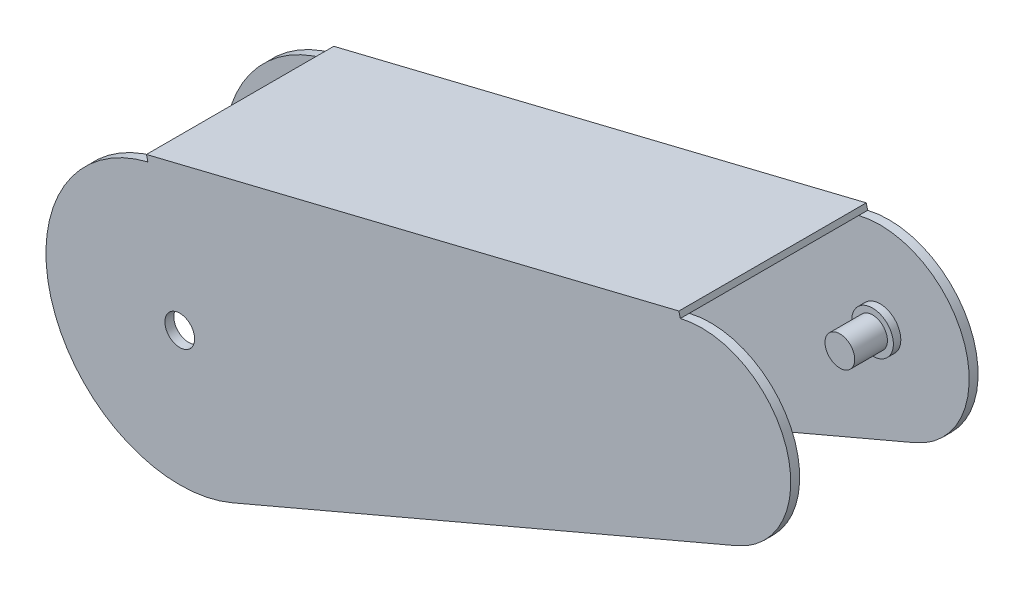
ISO-10303-21;
HEADER;
FILE_DESCRIPTION(('STEP AP214'),'2;1');
FILE_NAME('part.step','',(''),(''),'','','');
FILE_SCHEMA(('AUTOMOTIVE_DESIGN { 1 0 10303 214 1 1 1 1 }'));
ENDSEC;
DATA;
#1=APPLICATION_CONTEXT('core data for automotive mechanical design processes');
#2=APPLICATION_PROTOCOL_DEFINITION('international standard','automotive_design',2000,#1);
#3=PRODUCT_CONTEXT('',#1,'mechanical');
#4=PRODUCT('Part','Part','',(#3));
#5=PRODUCT_RELATED_PRODUCT_CATEGORY('part','',(#4));
#6=PRODUCT_DEFINITION_FORMATION('','',#4);
#7=PRODUCT_DEFINITION_CONTEXT('part definition',#1,'design');
#8=PRODUCT_DEFINITION('design','',#6,#7);
#9=PRODUCT_DEFINITION_SHAPE('','',#8);
#10=(LENGTH_UNIT() NAMED_UNIT(*) SI_UNIT(.MILLI.,.METRE.));
#11=(NAMED_UNIT(*) PLANE_ANGLE_UNIT() SI_UNIT($,.RADIAN.));
#12=(NAMED_UNIT(*) SI_UNIT($,.STERADIAN.) SOLID_ANGLE_UNIT());
#13=UNCERTAINTY_MEASURE_WITH_UNIT(LENGTH_MEASURE(1.E-05),#10,'distance_accuracy_value','');
#14=(GEOMETRIC_REPRESENTATION_CONTEXT(3) GLOBAL_UNCERTAINTY_ASSIGNED_CONTEXT((#13)) GLOBAL_UNIT_ASSIGNED_CONTEXT((#10,
#11,#12)) REPRESENTATION_CONTEXT('',''));
#15=CARTESIAN_POINT('',(0.,0.,0.));
#16=DIRECTION('',(0.,0.,1.));
#17=DIRECTION('',(1.,0.,0.));
#18=AXIS2_PLACEMENT_3D('',#15,#16,#17);
#19=CARTESIAN_POINT('',(0.,0.,60.));
#20=DIRECTION('',(0.,0.,1.));
#21=DIRECTION('',(1.,0.,0.));
#22=AXIS2_PLACEMENT_3D('',#19,#20,#21);
#23=PLANE('',#22);
#24=CARTESIAN_POINT('',(-80.2518171707876,-21.7552317239954,60.));
#25=DIRECTION('',(0.,0.,1.));
#26=DIRECTION('',(1.,0.,0.));
#27=AXIS2_PLACEMENT_3D('',#24,#25,#26);
#28=CIRCLE('',#27,45.);
#29=CARTESIAN_POINT('',(-90.9758751371117,21.9482530424957,60.));
#30=VERTEX_POINT('',#29);
#31=CARTESIAN_POINT('',(-62.6050446285357,-63.1507800213912,60.));
#32=VERTEX_POINT('',#31);
#33=EDGE_CURVE('E214',#30,#32,#28,.T.);
#34=ORIENTED_EDGE('',*,*,#33,.F.);
#35=DIRECTION('',(0.971188550366469,0.238312399251647,0.));
#36=VECTOR('',#35,1.);
#37=CARTESIAN_POINT('',(-10.2466160263854,41.7577775897378,60.));
#38=LINE('',#37,#36);
#39=CARTESIAN_POINT('',(88.1024451932382,65.8908882349895,60.));
#40=VERTEX_POINT('',#39);
#41=EDGE_CURVE('E227',#30,#40,#38,.T.);
#42=ORIENTED_EDGE('',*,*,#41,.T.);
#43=CARTESIAN_POINT('',(95.2518171707876,36.7552317239955,60.));
#44=DIRECTION('',(0.,0.,1.));
#45=DIRECTION('',(1.,0.,0.));
#46=AXIS2_PLACEMENT_3D('',#43,#44,#45);
#47=CIRCLE('',#46,30.);
#48=CARTESIAN_POINT('',(107.016332198955,9.15819952573162,60.));
#49=VERTEX_POINT('',#48);
#50=EDGE_CURVE('E223',#49,#40,#47,.T.);
#51=ORIENTED_EDGE('',*,*,#50,.F.);
#52=DIRECTION('',(0.919901073275462,0.39215050093893,0.));
#53=VECTOR('',#52,1.);
#54=CARTESIAN_POINT('',(13.1534614003655,-30.8552028634739,60.));
#55=LINE('',#54,#53);
#56=EDGE_CURVE('E219',#32,#49,#55,.T.);
#57=ORIENTED_EDGE('',*,*,#56,.F.);
#58=EDGE_LOOP('',(#34,#42,#51,#57));
#59=FACE_BOUND('',#58,.T.);
#60=DIRECTION('',(0.948668293738244,0.316272775394546,0.));
#61=VECTOR('',#60,1.);
#62=CARTESIAN_POINT('',(-1.83345719319717,5.49950183016123,60.));
#63=LINE('',#62,#61);
#64=CARTESIAN_POINT('',(-75.9484707196831,-19.2094097895768,60.));
#65=VERTEX_POINT('',#64);
#66=CARTESIAN_POINT('',(88.353478337391,35.5665680458877,60.));
#67=VERTEX_POINT('',#66);
#68=EDGE_CURVE('E57',#65,#67,#63,.T.);
#69=ORIENTED_EDGE('',*,*,#68,.F.);
#70=CARTESIAN_POINT('',(-80.2518171707876,-21.7552317239954,60.));
#71=DIRECTION('',(0.,0.,1.));
#72=DIRECTION('',(1.,0.,0.));
#73=AXIS2_PLACEMENT_3D('',#70,#71,#72);
#74=CIRCLE('',#73,5.);
#75=CARTESIAN_POINT('',(-75.5084757020963,-20.1738678470227,60.));
#76=VERTEX_POINT('',#75);
#77=EDGE_CURVE('E61',#65,#76,#74,.T.);
#78=ORIENTED_EDGE('',*,*,#77,.T.);
#79=DIRECTION('',(-0.948668293738244,-0.316272775394545,0.));
#80=VECTOR('',#79,1.);
#81=CARTESIAN_POINT('',(-1.50007114300225,4.49950183016122,60.));
#82=LINE('',#81,#80);
#83=CARTESIAN_POINT('',(88.6111391146199,34.5413222962336,60.));
#84=VERTEX_POINT('',#83);
#85=EDGE_CURVE('E170',#84,#76,#82,.T.);
#86=ORIENTED_EDGE('',*,*,#85,.F.);
#87=CARTESIAN_POINT('',(95.2518171707876,36.7552317239955,60.));
#88=DIRECTION('',(0.,0.,1.));
#89=DIRECTION('',(1.,0.,0.));
#90=AXIS2_PLACEMENT_3D('',#87,#88,#89);
#91=CIRCLE('',#90,7.);
#92=EDGE_CURVE('E194',#67,#84,#91,.F.);
#93=ORIENTED_EDGE('',*,*,#92,.F.);
#94=EDGE_LOOP('',(#69,#78,#86,#93));
#95=FACE_BOUND('',#94,.T.);
#96=ADVANCED_FACE('F41',(#59,#95),#23,.F.);
#97=CARTESIAN_POINT('',(95.2518171707876,36.7552317239955,57.5));
#98=DIRECTION('',(0.,0.,1.));
#99=DIRECTION('',(1.,0.,0.));
#100=AXIS2_PLACEMENT_3D('',#97,#98,#99);
#101=CYLINDRICAL_SURFACE('',#100,7.);
#102=DIRECTION('',(0.,0.,1.));
#103=VECTOR('',#102,1.);
#104=CARTESIAN_POINT('',(88.353478337391,35.5665680458877,57.5));
#105=LINE('',#104,#103);
#106=CARTESIAN_POINT('',(88.353478337391,35.5665680458877,57.5));
#107=VERTEX_POINT('',#106);
#108=EDGE_CURVE('E11',#67,#107,#105,.F.);
#109=ORIENTED_EDGE('',*,*,#108,.F.);
#110=ORIENTED_EDGE('',*,*,#92,.T.);
#111=DIRECTION('',(0.,0.,1.));
#112=VECTOR('',#111,1.);
#113=CARTESIAN_POINT('',(88.6111391146199,34.5413222962336,57.5));
#114=LINE('',#113,#112);
#115=CARTESIAN_POINT('',(88.6111391146199,34.5413222962336,57.5));
#116=VERTEX_POINT('',#115);
#117=EDGE_CURVE('E50',#116,#84,#114,.T.);
#118=ORIENTED_EDGE('',*,*,#117,.F.);
#119=CARTESIAN_POINT('',(95.2518171707876,36.7552317239955,57.5));
#120=DIRECTION('',(0.,0.,-1.));
#121=DIRECTION('',(-1.,0.,0.));
#122=AXIS2_PLACEMENT_3D('',#119,#120,#121);
#123=CIRCLE('',#122,7.);
#124=EDGE_CURVE('E189',#107,#116,#123,.T.);
#125=ORIENTED_EDGE('',*,*,#124,.F.);
#126=EDGE_LOOP('',(#109,#110,#118,#125));
#127=FACE_BOUND('',#126,.T.);
#128=ADVANCED_FACE('F348',(#127),#101,.T.);
#129=CARTESIAN_POINT('',(0.,0.,3.));
#130=DIRECTION('',(0.,0.,1.));
#131=DIRECTION('',(1.,0.,0.));
#132=AXIS2_PLACEMENT_3D('',#129,#130,#131);
#133=PLANE('',#132);
#134=CARTESIAN_POINT('',(-80.2518171707876,-21.7552317239954,3.));
#135=DIRECTION('',(0.,0.,1.));
#136=DIRECTION('',(1.,0.,0.));
#137=AXIS2_PLACEMENT_3D('',#134,#135,#136);
#138=CIRCLE('',#137,5.);
#139=CARTESIAN_POINT('',(-75.2518171707876,-21.7552317239954,3.));
#140=VERTEX_POINT('',#139);
#141=EDGE_CURVE('E306',#140,#140,#138,.T.);
#142=ORIENTED_EDGE('',*,*,#141,.F.);
#143=EDGE_LOOP('',(#142));
#144=FACE_BOUND('',#143,.T.);
#145=DIRECTION('',(0.919901073275462,0.39215050093893,0.));
#146=VECTOR('',#145,1.);
#147=CARTESIAN_POINT('',(13.1534614003655,-30.8552028634739,3.));
#148=LINE('',#147,#146);
#149=CARTESIAN_POINT('',(-62.6050446285357,-63.1507800213912,3.));
#150=VERTEX_POINT('',#149);
#151=CARTESIAN_POINT('',(107.016332198955,9.15819952573162,3.));
#152=VERTEX_POINT('',#151);
#153=EDGE_CURVE('E290',#150,#152,#148,.T.);
#154=ORIENTED_EDGE('',*,*,#153,.T.);
#155=CARTESIAN_POINT('',(95.2518171707876,36.7552317239955,3.));
#156=DIRECTION('',(0.,0.,1.));
#157=DIRECTION('',(1.,0.,0.));
#158=AXIS2_PLACEMENT_3D('',#155,#156,#157);
#159=CIRCLE('',#158,30.);
#160=CARTESIAN_POINT('',(88.1024451932382,65.8908882349895,3.));
#161=VERTEX_POINT('',#160);
#162=EDGE_CURVE('E294',#152,#161,#159,.T.);
#163=ORIENTED_EDGE('',*,*,#162,.T.);
#164=DIRECTION('',(0.971188550366469,0.238312399251647,0.));
#165=VECTOR('',#164,1.);
#166=CARTESIAN_POINT('',(-10.2466160263854,41.7577775897378,3.));
#167=LINE('',#166,#165);
#168=CARTESIAN_POINT('',(-90.9758751371117,21.9482530424957,3.));
#169=VERTEX_POINT('',#168);
#170=EDGE_CURVE('E299',#169,#161,#167,.T.);
#171=ORIENTED_EDGE('',*,*,#170,.F.);
#172=CARTESIAN_POINT('',(-80.2518171707876,-21.7552317239954,3.));
#173=DIRECTION('',(0.,0.,1.));
#174=DIRECTION('',(1.,0.,0.));
#175=AXIS2_PLACEMENT_3D('',#172,#173,#174);
#176=CIRCLE('',#175,45.);
#177=EDGE_CURVE('E303',#169,#150,#176,.T.);
#178=ORIENTED_EDGE('',*,*,#177,.T.);
#179=EDGE_LOOP('',(#154,#163,#171,#178));
#180=FACE_BOUND('',#179,.T.);
#181=CARTESIAN_POINT('',(95.2518171707876,36.7552317239955,3.));
#182=DIRECTION('',(0.,0.,1.));
#183=DIRECTION('',(1.,0.,0.));
#184=AXIS2_PLACEMENT_3D('',#181,#182,#183);
#185=CIRCLE('',#184,7.);
#186=CARTESIAN_POINT('',(102.251817170788,36.7552317239955,3.));
#187=VERTEX_POINT('',#186);
#188=EDGE_CURVE('E203',#187,#187,#185,.T.);
#189=ORIENTED_EDGE('',*,*,#188,.F.);
#190=EDGE_LOOP('',(#189));
#191=FACE_BOUND('',#190,.T.);
#192=ADVANCED_FACE('F374',(#144,#180,#191),#133,.T.);
#193=CARTESIAN_POINT('',(-10.2466160263854,41.7577775897378,0.));
#194=DIRECTION('',(-0.238312399251647,0.971188550366469,0.));
#195=DIRECTION('',(-0.971188550366469,-0.238312399251647,0.));
#196=AXIS2_PLACEMENT_3D('',#193,#194,#195);
#197=PLANE('',#196);
#198=ORIENTED_EDGE('',*,*,#41,.F.);
#199=DIRECTION('',(0.,0.,1.));
#200=VECTOR('',#199,1.);
#201=CARTESIAN_POINT('',(-90.9758751371117,21.9482530424957,0.));
#202=LINE('',#201,#200);
#203=EDGE_CURVE('E248',#169,#30,#202,.T.);
#204=ORIENTED_EDGE('',*,*,#203,.F.);
#205=ORIENTED_EDGE('',*,*,#170,.T.);
#206=DIRECTION('',(0.,0.,-1.));
#207=VECTOR('',#206,1.);
#208=CARTESIAN_POINT('',(88.1024451932382,65.8908882349895,0.));
#209=LINE('',#208,#207);
#210=EDGE_CURVE('E272',#40,#161,#209,.T.);
#211=ORIENTED_EDGE('',*,*,#210,.F.);
#212=EDGE_LOOP('',(#198,#204,#205,#211));
#213=FACE_BOUND('',#212,.T.);
#214=ADVANCED_FACE('F401',(#213),#197,.F.);
#215=CARTESIAN_POINT('',(13.1534614003655,-30.8552028634739,3.));
#216=DIRECTION('',(-0.39215050093893,0.919901073275462,0.));
#217=DIRECTION('',(-0.919901073275462,-0.39215050093893,0.));
#218=AXIS2_PLACEMENT_3D('',#215,#216,#217);
#219=PLANE('',#218);
#220=DIRECTION('',(0.919901073275462,0.39215050093893,0.));
#221=VECTOR('',#220,1.);
#222=CARTESIAN_POINT('',(13.1534614003655,-30.8552028634739,0.));
#223=LINE('',#222,#221);
#224=CARTESIAN_POINT('',(-62.6050446285357,-63.1507800213912,0.));
#225=VERTEX_POINT('',#224);
#226=CARTESIAN_POINT('',(107.016332198955,9.15819952573162,0.));
#227=VERTEX_POINT('',#226);
#228=EDGE_CURVE('E289',#225,#227,#223,.T.);
#229=ORIENTED_EDGE('',*,*,#228,.T.);
#230=DIRECTION('',(0.,0.,-1.));
#231=VECTOR('',#230,1.);
#232=CARTESIAN_POINT('',(107.016332198955,9.15819952573162,3.));
#233=LINE('',#232,#231);
#234=EDGE_CURVE('E335',#152,#227,#233,.T.);
#235=ORIENTED_EDGE('',*,*,#234,.F.);
#236=ORIENTED_EDGE('',*,*,#153,.F.);
#237=DIRECTION('',(0.,0.,-1.));
#238=VECTOR('',#237,1.);
#239=CARTESIAN_POINT('',(-62.6050446285357,-63.1507800213912,3.));
#240=LINE('',#239,#238);
#241=EDGE_CURVE('E310',#150,#225,#240,.T.);
#242=ORIENTED_EDGE('',*,*,#241,.T.);
#243=EDGE_LOOP('',(#229,#235,#236,#242));
#244=FACE_BOUND('',#243,.T.);
#245=ADVANCED_FACE('F43',(#244),#219,.F.);
#246=CARTESIAN_POINT('',(95.2518171707876,36.7552317239955,3.));
#247=DIRECTION('',(0.,0.,-1.));
#248=DIRECTION('',(-1.,0.,0.));
#249=AXIS2_PLACEMENT_3D('',#246,#247,#248);
#250=CYLINDRICAL_SURFACE('',#249,30.);
#251=CARTESIAN_POINT('',(95.2518171707876,36.7552317239955,0.));
#252=DIRECTION('',(0.,0.,1.));
#253=DIRECTION('',(1.,0.,0.));
#254=AXIS2_PLACEMENT_3D('',#251,#252,#253);
#255=CIRCLE('',#254,30.);
#256=CARTESIAN_POINT('',(88.1024451932382,65.8908882349895,0.));
#257=VERTEX_POINT('',#256);
#258=EDGE_CURVE('E314',#227,#257,#255,.T.);
#259=ORIENTED_EDGE('',*,*,#258,.T.);
#260=DIRECTION('',(0.,0.,-1.));
#261=VECTOR('',#260,1.);
#262=CARTESIAN_POINT('',(88.1024451932382,65.8908882349895,3.));
#263=LINE('',#262,#261);
#264=EDGE_CURVE('E331',#161,#257,#263,.T.);
#265=ORIENTED_EDGE('',*,*,#264,.F.);
#266=ORIENTED_EDGE('',*,*,#162,.F.);
#267=ORIENTED_EDGE('',*,*,#234,.T.);
#268=EDGE_LOOP('',(#259,#265,#266,#267));
#269=FACE_BOUND('',#268,.T.);
#270=ADVANCED_FACE('F427',(#269),#250,.T.);
#271=CARTESIAN_POINT('',(-80.2518171707876,-21.7552317239954,3.));
#272=DIRECTION('',(0.,0.,-1.));
#273=DIRECTION('',(-1.,0.,0.));
#274=AXIS2_PLACEMENT_3D('',#271,#272,#273);
#275=CYLINDRICAL_SURFACE('',#274,5.);
#276=ORIENTED_EDGE('',*,*,#141,.T.);
#277=EDGE_LOOP('',(#276));
#278=FACE_BOUND('',#277,.T.);
#279=CARTESIAN_POINT('',(-80.2518171707876,-21.7552317239954,0.));
#280=DIRECTION('',(0.,0.,1.));
#281=DIRECTION('',(1.,0.,0.));
#282=AXIS2_PLACEMENT_3D('',#279,#280,#281);
#283=CIRCLE('',#282,5.);
#284=CARTESIAN_POINT('',(-75.2518171707876,-21.7552317239954,0.));
#285=VERTEX_POINT('',#284);
#286=EDGE_CURVE('E295',#285,#285,#283,.T.);
#287=ORIENTED_EDGE('',*,*,#286,.F.);
#288=EDGE_LOOP('',(#287));
#289=FACE_BOUND('',#288,.T.);
#290=ADVANCED_FACE('F424',(#278,#289),#275,.F.);
#291=CARTESIAN_POINT('',(-80.2518171707876,-21.7552317239954,3.));
#292=DIRECTION('',(0.,0.,-1.));
#293=DIRECTION('',(-1.,0.,0.));
#294=AXIS2_PLACEMENT_3D('',#291,#292,#293);
#295=CYLINDRICAL_SURFACE('',#294,45.);
#296=CARTESIAN_POINT('',(-80.2518171707876,-21.7552317239954,0.));
#297=DIRECTION('',(0.,0.,1.));
#298=DIRECTION('',(1.,0.,0.));
#299=AXIS2_PLACEMENT_3D('',#296,#297,#298);
#300=CIRCLE('',#299,45.);
#301=CARTESIAN_POINT('',(-90.9758751371117,21.9482530424957,0.));
#302=VERTEX_POINT('',#301);
#303=EDGE_CURVE('E318',#302,#225,#300,.T.);
#304=ORIENTED_EDGE('',*,*,#303,.T.);
#305=ORIENTED_EDGE('',*,*,#241,.F.);
#306=ORIENTED_EDGE('',*,*,#177,.F.);
#307=DIRECTION('',(0.,0.,-1.));
#308=VECTOR('',#307,1.);
#309=CARTESIAN_POINT('',(-90.9758751371117,21.9482530424957,3.));
#310=LINE('',#309,#308);
#311=EDGE_CURVE('E327',#169,#302,#310,.T.);
#312=ORIENTED_EDGE('',*,*,#311,.T.);
#313=EDGE_LOOP('',(#304,#305,#306,#312));
#314=FACE_BOUND('',#313,.T.);
#315=ADVANCED_FACE('F422',(#314),#295,.T.);
#316=CARTESIAN_POINT('',(0.,0.,0.));
#317=DIRECTION('',(0.,0.,1.));
#318=DIRECTION('',(1.,0.,0.));
#319=AXIS2_PLACEMENT_3D('',#316,#317,#318);
#320=PLANE('',#319);
#321=ORIENTED_EDGE('',*,*,#228,.F.);
#322=ORIENTED_EDGE('',*,*,#303,.F.);
#323=DIRECTION('',(0.238312399251647,-0.971188550366469,0.));
#324=VECTOR('',#323,1.);
#325=CARTESIAN_POINT('',(-91.452499935615,23.8906301432286,0.));
#326=LINE('',#325,#324);
#327=CARTESIAN_POINT('',(-91.452499935615,23.8906301432286,0.));
#328=VERTEX_POINT('',#327);
#329=EDGE_CURVE('E268',#328,#302,#326,.T.);
#330=ORIENTED_EDGE('',*,*,#329,.F.);
#331=DIRECTION('',(-0.971188550366469,-0.238312399251647,0.));
#332=VECTOR('',#331,1.);
#333=CARTESIAN_POINT('',(-91.452499935615,23.8906301432286,0.));
#334=LINE('',#333,#332);
#335=CARTESIAN_POINT('',(87.6258203947349,67.8332653357225,0.));
#336=VERTEX_POINT('',#335);
#337=EDGE_CURVE('E265',#336,#328,#334,.T.);
#338=ORIENTED_EDGE('',*,*,#337,.F.);
#339=DIRECTION('',(0.238312399251647,-0.971188550366469,0.));
#340=VECTOR('',#339,1.);
#341=CARTESIAN_POINT('',(87.6258203947349,67.8332653357225,0.));
#342=LINE('',#341,#340);
#343=EDGE_CURVE('E278',#336,#257,#342,.T.);
#344=ORIENTED_EDGE('',*,*,#343,.T.);
#345=ORIENTED_EDGE('',*,*,#258,.F.);
#346=EDGE_LOOP('',(#321,#322,#330,#338,#344,#345));
#347=FACE_BOUND('',#346,.T.);
#348=ORIENTED_EDGE('',*,*,#286,.T.);
#349=EDGE_LOOP('',(#348));
#350=FACE_BOUND('',#349,.T.);
#351=ADVANCED_FACE('F415',(#347,#350),#320,.F.);
#352=CARTESIAN_POINT('',(-91.452499935615,23.8906301432286,0.));
#353=DIRECTION('',(0.971188550366469,0.238312399251647,0.));
#354=DIRECTION('',(-0.238312399251647,0.971188550366469,0.));
#355=AXIS2_PLACEMENT_3D('',#352,#353,#354);
#356=PLANE('',#355);
#357=ORIENTED_EDGE('',*,*,#311,.F.);
#358=ORIENTED_EDGE('',*,*,#203,.T.);
#359=DIRECTION('',(0.,0.,1.));
#360=VECTOR('',#359,1.);
#361=CARTESIAN_POINT('',(-90.9758751371117,21.9482530424957,60.));
#362=LINE('',#361,#360);
#363=CARTESIAN_POINT('',(-90.9758751371117,21.9482530424957,63.));
#364=VERTEX_POINT('',#363);
#365=EDGE_CURVE('E244',#30,#364,#362,.T.);
#366=ORIENTED_EDGE('',*,*,#365,.T.);
#367=DIRECTION('',(0.238312399251647,-0.971188550366469,0.));
#368=VECTOR('',#367,1.);
#369=CARTESIAN_POINT('',(-91.452499935615,23.8906301432286,63.));
#370=LINE('',#369,#368);
#371=CARTESIAN_POINT('',(-91.452499935615,23.8906301432286,63.));
#372=VERTEX_POINT('',#371);
#373=EDGE_CURVE('E285',#372,#364,#370,.T.);
#374=ORIENTED_EDGE('',*,*,#373,.F.);
#375=DIRECTION('',(0.,0.,1.));
#376=VECTOR('',#375,1.);
#377=CARTESIAN_POINT('',(-91.452499935615,23.8906301432286,0.));
#378=LINE('',#377,#376);
#379=EDGE_CURVE('E254',#328,#372,#378,.T.);
#380=ORIENTED_EDGE('',*,*,#379,.F.);
#381=ORIENTED_EDGE('',*,*,#329,.T.);
#382=EDGE_LOOP('',(#357,#358,#366,#374,#380,#381));
#383=FACE_BOUND('',#382,.T.);
#384=ADVANCED_FACE('F411',(#383),#356,.F.);
#385=CARTESIAN_POINT('',(-91.452499935615,23.8906301432286,63.));
#386=DIRECTION('',(0.,0.,-1.));
#387=DIRECTION('',(-1.,0.,0.));
#388=AXIS2_PLACEMENT_3D('',#385,#386,#387);
#389=PLANE('',#388);
#390=ORIENTED_EDGE('',*,*,#373,.T.);
#391=CARTESIAN_POINT('',(-80.2518171707876,-21.7552317239954,63.));
#392=DIRECTION('',(0.,0.,1.));
#393=DIRECTION('',(1.,0.,0.));
#394=AXIS2_PLACEMENT_3D('',#391,#392,#393);
#395=CIRCLE('',#394,45.);
#396=CARTESIAN_POINT('',(-62.6050446285357,-63.1507800213912,63.));
#397=VERTEX_POINT('',#396);
#398=EDGE_CURVE('E234',#364,#397,#395,.T.);
#399=ORIENTED_EDGE('',*,*,#398,.T.);
#400=DIRECTION('',(0.919901073275462,0.39215050093893,0.));
#401=VECTOR('',#400,1.);
#402=CARTESIAN_POINT('',(13.1534614003655,-30.8552028634739,63.));
#403=LINE('',#402,#401);
#404=CARTESIAN_POINT('',(107.016332198955,9.15819952573162,63.));
#405=VERTEX_POINT('',#404);
#406=EDGE_CURVE('E238',#397,#405,#403,.T.);
#407=ORIENTED_EDGE('',*,*,#406,.T.);
#408=CARTESIAN_POINT('',(95.2518171707876,36.7552317239955,63.));
#409=DIRECTION('',(0.,0.,1.));
#410=DIRECTION('',(1.,0.,0.));
#411=AXIS2_PLACEMENT_3D('',#408,#409,#410);
#412=CIRCLE('',#411,30.);
#413=CARTESIAN_POINT('',(88.1024451932382,65.8908882349895,63.));
#414=VERTEX_POINT('',#413);
#415=EDGE_CURVE('E215',#405,#414,#412,.T.);
#416=ORIENTED_EDGE('',*,*,#415,.T.);
#417=DIRECTION('',(0.238312399251647,-0.971188550366469,0.));
#418=VECTOR('',#417,1.);
#419=CARTESIAN_POINT('',(87.6258203947349,67.8332653357225,63.));
#420=LINE('',#419,#418);
#421=CARTESIAN_POINT('',(87.6258203947349,67.8332653357225,63.));
#422=VERTEX_POINT('',#421);
#423=EDGE_CURVE('E281',#422,#414,#420,.T.);
#424=ORIENTED_EDGE('',*,*,#423,.F.);
#425=DIRECTION('',(0.971188550366469,0.238312399251647,0.));
#426=VECTOR('',#425,1.);
#427=CARTESIAN_POINT('',(-91.452499935615,23.8906301432286,63.));
#428=LINE('',#427,#426);
#429=EDGE_CURVE('E258',#372,#422,#428,.T.);
#430=ORIENTED_EDGE('',*,*,#429,.F.);
#431=EDGE_LOOP('',(#390,#399,#407,#416,#424,#430));
#432=FACE_BOUND('',#431,.T.);
#433=CARTESIAN_POINT('',(-80.2518171707876,-21.7552317239954,63.));
#434=DIRECTION('',(0.,0.,1.));
#435=DIRECTION('',(1.,0.,0.));
#436=AXIS2_PLACEMENT_3D('',#433,#434,#435);
#437=CIRCLE('',#436,5.);
#438=CARTESIAN_POINT('',(-75.2518171707876,-21.7552317239954,63.));
#439=VERTEX_POINT('',#438);
#440=EDGE_CURVE('E208',#439,#439,#437,.T.);
#441=ORIENTED_EDGE('',*,*,#440,.F.);
#442=EDGE_LOOP('',(#441));
#443=FACE_BOUND('',#442,.T.);
#444=ADVANCED_FACE('F407',(#432,#443),#389,.F.);
#445=CARTESIAN_POINT('',(87.6258203947349,67.8332653357225,0.));
#446=DIRECTION('',(-0.971188550366469,-0.238312399251647,0.));
#447=DIRECTION('',(0.238312399251647,-0.971188550366469,0.));
#448=AXIS2_PLACEMENT_3D('',#445,#446,#447);
#449=PLANE('',#448);
#450=EDGE_CURVE('E259',#414,#40,#209,.T.);
#451=ORIENTED_EDGE('',*,*,#450,.T.);
#452=ORIENTED_EDGE('',*,*,#210,.T.);
#453=ORIENTED_EDGE('',*,*,#264,.T.);
#454=ORIENTED_EDGE('',*,*,#343,.F.);
#455=DIRECTION('',(0.,0.,-1.));
#456=VECTOR('',#455,1.);
#457=CARTESIAN_POINT('',(87.6258203947349,67.8332653357225,0.));
#458=LINE('',#457,#456);
#459=EDGE_CURVE('E262',#422,#336,#458,.T.);
#460=ORIENTED_EDGE('',*,*,#459,.F.);
#461=ORIENTED_EDGE('',*,*,#423,.T.);
#462=EDGE_LOOP('',(#451,#452,#453,#454,#460,#461));
#463=FACE_BOUND('',#462,.T.);
#464=ADVANCED_FACE('F399',(#463),#449,.F.);
#465=CARTESIAN_POINT('',(-10.7232408248887,43.7001546904707,0.));
#466=DIRECTION('',(-0.238312399251647,0.971188550366469,0.));
#467=DIRECTION('',(-0.971188550366469,-0.238312399251647,0.));
#468=AXIS2_PLACEMENT_3D('',#465,#466,#467);
#469=PLANE('',#468);
#470=ORIENTED_EDGE('',*,*,#379,.T.);
#471=ORIENTED_EDGE('',*,*,#429,.T.);
#472=ORIENTED_EDGE('',*,*,#459,.T.);
#473=ORIENTED_EDGE('',*,*,#337,.T.);
#474=EDGE_LOOP('',(#470,#471,#472,#473));
#475=FACE_BOUND('',#474,.T.);
#476=ADVANCED_FACE('F392',(#475),#469,.T.);
#477=CARTESIAN_POINT('',(-80.2518171707876,-21.7552317239954,60.));
#478=DIRECTION('',(0.,0.,1.));
#479=DIRECTION('',(1.,0.,0.));
#480=AXIS2_PLACEMENT_3D('',#477,#478,#479);
#481=CYLINDRICAL_SURFACE('',#480,45.);
#482=ORIENTED_EDGE('',*,*,#398,.F.);
#483=ORIENTED_EDGE('',*,*,#365,.F.);
#484=ORIENTED_EDGE('',*,*,#33,.T.);
#485=DIRECTION('',(0.,0.,1.));
#486=VECTOR('',#485,1.);
#487=CARTESIAN_POINT('',(-62.6050446285357,-63.1507800213912,60.));
#488=LINE('',#487,#486);
#489=EDGE_CURVE('E230',#32,#397,#488,.T.);
#490=ORIENTED_EDGE('',*,*,#489,.T.);
#491=EDGE_LOOP('',(#482,#483,#484,#490));
#492=FACE_BOUND('',#491,.T.);
#493=ADVANCED_FACE('F385',(#492),#481,.T.);
#494=CARTESIAN_POINT('',(95.2518171707876,36.7552317239955,60.));
#495=DIRECTION('',(0.,0.,1.));
#496=DIRECTION('',(1.,0.,0.));
#497=AXIS2_PLACEMENT_3D('',#494,#495,#496);
#498=CYLINDRICAL_SURFACE('',#497,30.);
#499=ORIENTED_EDGE('',*,*,#415,.F.);
#500=DIRECTION('',(0.,0.,1.));
#501=VECTOR('',#500,1.);
#502=CARTESIAN_POINT('',(107.016332198955,9.15819952573162,60.));
#503=LINE('',#502,#501);
#504=EDGE_CURVE('E249',#49,#405,#503,.T.);
#505=ORIENTED_EDGE('',*,*,#504,.F.);
#506=ORIENTED_EDGE('',*,*,#50,.T.);
#507=ORIENTED_EDGE('',*,*,#450,.F.);
#508=EDGE_LOOP('',(#499,#505,#506,#507));
#509=FACE_BOUND('',#508,.T.);
#510=ADVANCED_FACE('F381',(#509),#498,.T.);
#511=CARTESIAN_POINT('',(13.1534614003655,-30.8552028634739,60.));
#512=DIRECTION('',(0.39215050093893,-0.919901073275462,0.));
#513=DIRECTION('',(0.919901073275462,0.39215050093893,0.));
#514=AXIS2_PLACEMENT_3D('',#511,#512,#513);
#515=PLANE('',#514);
#516=ORIENTED_EDGE('',*,*,#406,.F.);
#517=ORIENTED_EDGE('',*,*,#489,.F.);
#518=ORIENTED_EDGE('',*,*,#56,.T.);
#519=ORIENTED_EDGE('',*,*,#504,.T.);
#520=EDGE_LOOP('',(#516,#517,#518,#519));
#521=FACE_BOUND('',#520,.T.);
#522=ADVANCED_FACE('F384',(#521),#515,.T.);
#523=CARTESIAN_POINT('',(-80.2518171707876,-21.7552317239954,60.));
#524=DIRECTION('',(0.,0.,1.));
#525=DIRECTION('',(1.,0.,0.));
#526=AXIS2_PLACEMENT_3D('',#523,#524,#525);
#527=CYLINDRICAL_SURFACE('',#526,5.);
#528=ORIENTED_EDGE('',*,*,#77,.F.);
#529=DIRECTION('',(0.,0.,1.));
#530=VECTOR('',#529,1.);
#531=CARTESIAN_POINT('',(-75.9484707196831,-19.2094097895768,55.));
#532=LINE('',#531,#530);
#533=CARTESIAN_POINT('',(-75.9484707196831,-19.2094097895768,55.));
#534=VERTEX_POINT('',#533);
#535=EDGE_CURVE('E153',#534,#65,#532,.T.);
#536=ORIENTED_EDGE('',*,*,#535,.F.);
#537=CARTESIAN_POINT('',(-80.2518171707876,-21.7552317239954,55.));
#538=DIRECTION('',(0.,0.,-1.));
#539=DIRECTION('',(-1.,0.,0.));
#540=AXIS2_PLACEMENT_3D('',#537,#538,#539);
#541=CIRCLE('',#540,5.);
#542=CARTESIAN_POINT('',(-75.5084757020963,-20.1738678470227,55.));
#543=VERTEX_POINT('',#542);
#544=EDGE_CURVE('E160',#543,#534,#541,.F.);
#545=ORIENTED_EDGE('',*,*,#544,.F.);
#546=DIRECTION('',(0.,0.,1.));
#547=VECTOR('',#546,1.);
#548=CARTESIAN_POINT('',(-75.5084757020963,-20.1738678470227,55.));
#549=LINE('',#548,#547);
#550=EDGE_CURVE('E358',#543,#76,#549,.T.);
#551=ORIENTED_EDGE('',*,*,#550,.T.);
#552=EDGE_LOOP('',(#528,#536,#545,#551));
#553=FACE_BOUND('',#552,.T.);
#554=ORIENTED_EDGE('',*,*,#440,.T.);
#555=EDGE_LOOP('',(#554));
#556=FACE_BOUND('',#555,.T.);
#557=ADVANCED_FACE('F172',(#553,#556),#527,.F.);
#558=CARTESIAN_POINT('',(95.2518171707876,36.7552317239955,5.5));
#559=DIRECTION('',(0.,0.,1.));
#560=DIRECTION('',(1.,0.,0.));
#561=AXIS2_PLACEMENT_3D('',#558,#559,#560);
#562=PLANE('',#561);
#563=CARTESIAN_POINT('',(95.2518171707876,36.7552317239955,5.5));
#564=DIRECTION('',(0.,0.,1.));
#565=DIRECTION('',(1.,0.,0.));
#566=AXIS2_PLACEMENT_3D('',#563,#564,#565);
#567=CIRCLE('',#566,7.);
#568=CARTESIAN_POINT('',(102.251817170788,36.7552317239955,5.5));
#569=VERTEX_POINT('',#568);
#570=EDGE_CURVE('E204',#569,#569,#567,.T.);
#571=ORIENTED_EDGE('',*,*,#570,.T.);
#572=EDGE_LOOP('',(#571));
#573=FACE_BOUND('',#572,.T.);
#574=CARTESIAN_POINT('',(95.2518171707876,36.7552317239955,5.5));
#575=DIRECTION('',(0.,0.,1.));
#576=DIRECTION('',(1.,0.,0.));
#577=AXIS2_PLACEMENT_3D('',#574,#575,#576);
#578=CIRCLE('',#577,5.00000000000002);
#579=CARTESIAN_POINT('',(100.251817170788,36.7552317239955,5.5));
#580=VERTEX_POINT('',#579);
#581=EDGE_CURVE('E199',#580,#580,#578,.T.);
#582=ORIENTED_EDGE('',*,*,#581,.F.);
#583=EDGE_LOOP('',(#582));
#584=FACE_BOUND('',#583,.T.);
#585=ADVANCED_FACE('F396',(#573,#584),#562,.T.);
#586=CARTESIAN_POINT('',(95.2518171707876,36.7552317239955,5.5));
#587=DIRECTION('',(0.,0.,-1.));
#588=DIRECTION('',(-1.,0.,0.));
#589=AXIS2_PLACEMENT_3D('',#586,#587,#588);
#590=CYLINDRICAL_SURFACE('',#589,7.);
#591=ORIENTED_EDGE('',*,*,#570,.F.);
#592=EDGE_LOOP('',(#591));
#593=FACE_BOUND('',#592,.T.);
#594=ORIENTED_EDGE('',*,*,#188,.T.);
#595=EDGE_LOOP('',(#594));
#596=FACE_BOUND('',#595,.T.);
#597=ADVANCED_FACE('F379',(#593,#596),#590,.T.);
#598=CARTESIAN_POINT('',(95.2518171707876,36.7552317239955,57.5));
#599=DIRECTION('',(0.,0.,-1.));
#600=DIRECTION('',(-1.,0.,0.));
#601=AXIS2_PLACEMENT_3D('',#598,#599,#600);
#602=PLANE('',#601);
#603=CARTESIAN_POINT('',(95.2518171707876,36.7552317239955,57.5));
#604=DIRECTION('',(0.,0.,-1.));
#605=DIRECTION('',(-1.,0.,0.));
#606=AXIS2_PLACEMENT_3D('',#603,#604,#605);
#607=CIRCLE('',#606,5.00000000000001);
#608=CARTESIAN_POINT('',(90.2518171707876,36.7552317239955,57.5));
#609=VERTEX_POINT('',#608);
#610=EDGE_CURVE('E190',#609,#609,#607,.T.);
#611=ORIENTED_EDGE('',*,*,#610,.F.);
#612=EDGE_LOOP('',(#611));
#613=FACE_BOUND('',#612,.T.);
#614=EDGE_CURVE('E195',#116,#107,#123,.T.);
#615=ORIENTED_EDGE('',*,*,#614,.T.);
#616=ORIENTED_EDGE('',*,*,#124,.T.);
#617=EDGE_LOOP('',(#615,#616));
#618=FACE_BOUND('',#617,.T.);
#619=ADVANCED_FACE('F351',(#613,#618),#602,.T.);
#620=CARTESIAN_POINT('',(95.2518171707876,36.7552317239955,47.5));
#621=DIRECTION('',(0.,0.,1.));
#622=DIRECTION('',(1.,0.,0.));
#623=AXIS2_PLACEMENT_3D('',#620,#621,#622);
#624=CYLINDRICAL_SURFACE('',#623,5.00000000000001);
#625=CARTESIAN_POINT('',(95.2518171707876,36.7552317239955,47.5));
#626=DIRECTION('',(0.,0.,-1.));
#627=DIRECTION('',(-1.,0.,0.));
#628=AXIS2_PLACEMENT_3D('',#625,#626,#627);
#629=CIRCLE('',#628,5.00000000000001);
#630=CARTESIAN_POINT('',(90.2518171707876,36.7552317239955,47.5));
#631=VERTEX_POINT('',#630);
#632=EDGE_CURVE('E180',#631,#631,#629,.T.);
#633=ORIENTED_EDGE('',*,*,#632,.F.);
#634=EDGE_LOOP('',(#633));
#635=FACE_BOUND('',#634,.T.);
#636=ORIENTED_EDGE('',*,*,#610,.T.);
#637=EDGE_LOOP('',(#636));
#638=FACE_BOUND('',#637,.T.);
#639=ADVANCED_FACE('F474',(#635,#638),#624,.T.);
#640=CARTESIAN_POINT('',(95.2518171707876,36.7552317239955,47.5));
#641=DIRECTION('',(0.,0.,-1.));
#642=DIRECTION('',(-1.,0.,0.));
#643=AXIS2_PLACEMENT_3D('',#640,#641,#642);
#644=PLANE('',#643);
#645=ORIENTED_EDGE('',*,*,#632,.T.);
#646=EDGE_LOOP('',(#645));
#647=FACE_BOUND('',#646,.T.);
#648=ADVANCED_FACE('F490',(#647),#644,.T.);
#649=CARTESIAN_POINT('',(95.2518171707876,36.7552317239955,16.5));
#650=DIRECTION('',(0.,0.,-1.));
#651=DIRECTION('',(-1.,0.,0.));
#652=AXIS2_PLACEMENT_3D('',#649,#650,#651);
#653=PLANE('',#652);
#654=CARTESIAN_POINT('',(95.2518171707876,36.7552317239955,16.5));
#655=DIRECTION('',(0.,0.,-1.));
#656=DIRECTION('',(-1.,0.,0.));
#657=AXIS2_PLACEMENT_3D('',#654,#655,#656);
#658=CIRCLE('',#657,5.00000000000002);
#659=CARTESIAN_POINT('',(90.2518171707876,36.7552317239955,16.5));
#660=VERTEX_POINT('',#659);
#661=EDGE_CURVE('E175',#660,#660,#658,.T.);
#662=ORIENTED_EDGE('',*,*,#661,.F.);
#663=EDGE_LOOP('',(#662));
#664=FACE_BOUND('',#663,.T.);
#665=ADVANCED_FACE('F485',(#664),#653,.F.);
#666=CARTESIAN_POINT('',(95.2518171707876,36.7552317239955,16.5));
#667=DIRECTION('',(0.,0.,-1.));
#668=DIRECTION('',(-1.,0.,0.));
#669=AXIS2_PLACEMENT_3D('',#666,#667,#668);
#670=CYLINDRICAL_SURFACE('',#669,5.00000000000002);
#671=ORIENTED_EDGE('',*,*,#581,.T.);
#672=EDGE_LOOP('',(#671));
#673=FACE_BOUND('',#672,.T.);
#674=ORIENTED_EDGE('',*,*,#661,.T.);
#675=EDGE_LOOP('',(#674));
#676=FACE_BOUND('',#675,.T.);
#677=ADVANCED_FACE('F482',(#673,#676),#670,.T.);
#678=CARTESIAN_POINT('',(-1.83345719319717,5.49950183016123,55.));
#679=DIRECTION('',(0.316272775394546,-0.948668293738244,0.));
#680=DIRECTION('',(0.948668293738244,0.316272775394545,0.));
#681=AXIS2_PLACEMENT_3D('',#678,#679,#680);
#682=PLANE('',#681);
#683=ORIENTED_EDGE('',*,*,#68,.T.);
#684=ORIENTED_EDGE('',*,*,#108,.T.);
#685=DIRECTION('',(0.,0.,1.));
#686=VECTOR('',#685,1.);
#687=CARTESIAN_POINT('',(88.353478337391,35.5665680458877,55.));
#688=LINE('',#687,#686);
#689=CARTESIAN_POINT('',(88.353478337391,35.5665680458877,55.));
#690=VERTEX_POINT('',#689);
#691=EDGE_CURVE('E155',#690,#107,#688,.T.);
#692=ORIENTED_EDGE('',*,*,#691,.F.);
#693=DIRECTION('',(0.948668293738244,0.316272775394546,0.));
#694=VECTOR('',#693,1.);
#695=CARTESIAN_POINT('',(-1.83345719319717,5.49950183016123,55.));
#696=LINE('',#695,#694);
#697=EDGE_CURVE('E149',#534,#690,#696,.T.);
#698=ORIENTED_EDGE('',*,*,#697,.F.);
#699=ORIENTED_EDGE('',*,*,#535,.T.);
#700=EDGE_LOOP('',(#683,#684,#692,#698,#699));
#701=FACE_BOUND('',#700,.T.);
#702=ADVANCED_FACE('F151',(#701),#682,.F.);
#703=CARTESIAN_POINT('',(95.2518171707876,36.7552317239955,55.));
#704=DIRECTION('',(0.,0.,1.));
#705=DIRECTION('',(1.,0.,0.));
#706=AXIS2_PLACEMENT_3D('',#703,#704,#705);
#707=CYLINDRICAL_SURFACE('',#706,7.);
#708=ORIENTED_EDGE('',*,*,#614,.F.);
#709=DIRECTION('',(0.,0.,1.));
#710=VECTOR('',#709,1.);
#711=CARTESIAN_POINT('',(88.6111391146199,34.5413222962336,55.));
#712=LINE('',#711,#710);
#713=CARTESIAN_POINT('',(88.6111391146199,34.5413222962336,55.));
#714=VERTEX_POINT('',#713);
#715=EDGE_CURVE('E182',#714,#116,#712,.T.);
#716=ORIENTED_EDGE('',*,*,#715,.F.);
#717=CARTESIAN_POINT('',(95.2518171707876,36.7552317239955,55.));
#718=DIRECTION('',(0.,0.,-1.));
#719=DIRECTION('',(-1.,0.,0.));
#720=AXIS2_PLACEMENT_3D('',#717,#718,#719);
#721=CIRCLE('',#720,7.);
#722=EDGE_CURVE('E159',#690,#714,#721,.F.);
#723=ORIENTED_EDGE('',*,*,#722,.F.);
#724=ORIENTED_EDGE('',*,*,#691,.T.);
#725=EDGE_LOOP('',(#708,#716,#723,#724));
#726=FACE_BOUND('',#725,.T.);
#727=ADVANCED_FACE('F354',(#726),#707,.F.);
#728=CARTESIAN_POINT('',(-1.50007114300225,4.49950183016122,55.));
#729=DIRECTION('',(-0.316272775394545,0.948668293738244,0.));
#730=DIRECTION('',(-0.948668293738244,-0.316272775394545,0.));
#731=AXIS2_PLACEMENT_3D('',#728,#729,#730);
#732=PLANE('',#731);
#733=ORIENTED_EDGE('',*,*,#85,.T.);
#734=ORIENTED_EDGE('',*,*,#550,.F.);
#735=DIRECTION('',(-0.948668293738244,-0.316272775394545,0.));
#736=VECTOR('',#735,1.);
#737=CARTESIAN_POINT('',(-1.50007114300225,4.49950183016122,55.));
#738=LINE('',#737,#736);
#739=EDGE_CURVE('E165',#714,#543,#738,.T.);
#740=ORIENTED_EDGE('',*,*,#739,.F.);
#741=ORIENTED_EDGE('',*,*,#715,.T.);
#742=ORIENTED_EDGE('',*,*,#117,.T.);
#743=EDGE_LOOP('',(#733,#734,#740,#741,#742));
#744=FACE_BOUND('',#743,.T.);
#745=ADVANCED_FACE('F344',(#744),#732,.F.);
#746=CARTESIAN_POINT('',(0.,0.,55.));
#747=DIRECTION('',(0.,0.,-1.));
#748=DIRECTION('',(-1.,0.,0.));
#749=AXIS2_PLACEMENT_3D('',#746,#747,#748);
#750=PLANE('',#749);
#751=ORIENTED_EDGE('',*,*,#544,.T.);
#752=ORIENTED_EDGE('',*,*,#697,.T.);
#753=ORIENTED_EDGE('',*,*,#722,.T.);
#754=ORIENTED_EDGE('',*,*,#739,.T.);
#755=EDGE_LOOP('',(#751,#752,#753,#754));
#756=FACE_BOUND('',#755,.T.);
#757=ADVANCED_FACE('F163',(#756),#750,.T.);
#758=CLOSED_SHELL('',(#96,#128,#192,#214,#245,#270,#290,#315,#351,#384,#444,#464,#476,#493,#510,
#522,#557,#585,#597,#619,#639,#648,#665,#677,#702,#727,#745,#757));
#759=MANIFOLD_SOLID_BREP('B2',#758);
#760=ADVANCED_BREP_SHAPE_REPRESENTATION('',(#18,#759),#14);
#761=SHAPE_DEFINITION_REPRESENTATION(#9,#760);
ENDSEC;
END-ISO-10303-21;
